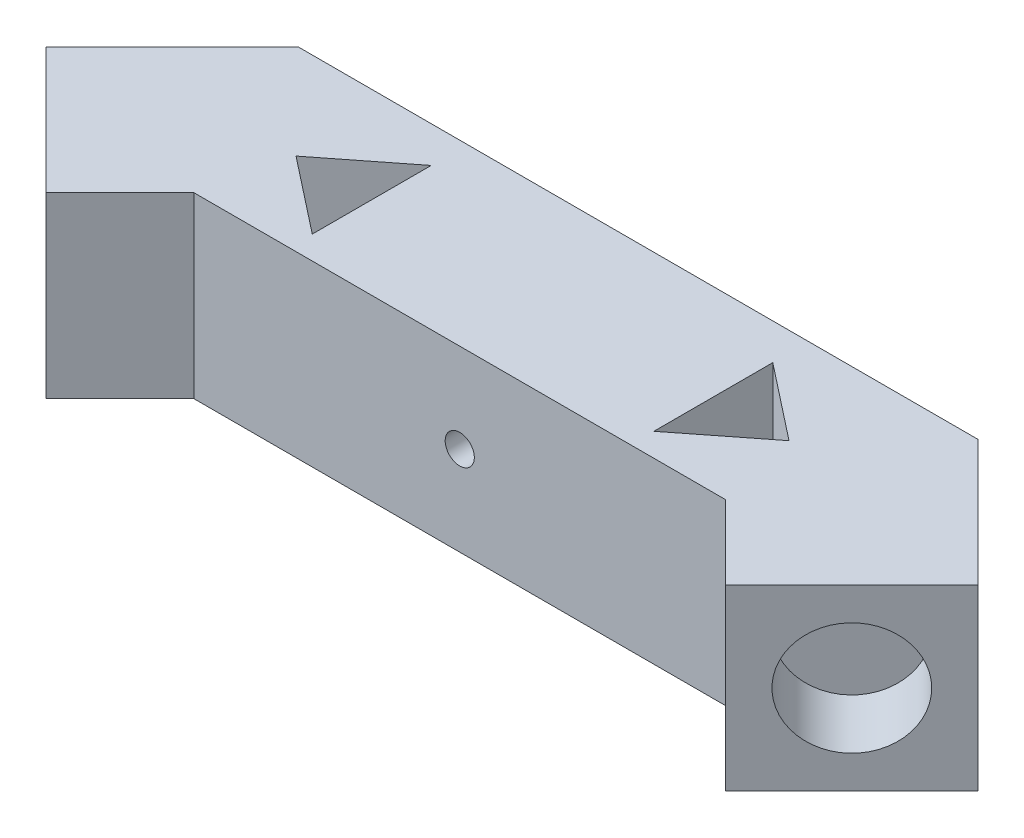
ISO-10303-21;
HEADER;
FILE_DESCRIPTION(('STEP AP214'),'2;1');
FILE_NAME('part.step','',(''),(''),'','','');
FILE_SCHEMA(('AUTOMOTIVE_DESIGN { 1 0 10303 214 1 1 1 1 }'));
ENDSEC;
DATA;
#1=APPLICATION_CONTEXT('core data for automotive mechanical design processes');
#2=APPLICATION_PROTOCOL_DEFINITION('international standard','automotive_design',2000,#1);
#3=PRODUCT_CONTEXT('',#1,'mechanical');
#4=PRODUCT('Part','Part','',(#3));
#5=PRODUCT_RELATED_PRODUCT_CATEGORY('part','',(#4));
#6=PRODUCT_DEFINITION_FORMATION('','',#4);
#7=PRODUCT_DEFINITION_CONTEXT('part definition',#1,'design');
#8=PRODUCT_DEFINITION('design','',#6,#7);
#9=PRODUCT_DEFINITION_SHAPE('','',#8);
#10=(LENGTH_UNIT() NAMED_UNIT(*) SI_UNIT(.MILLI.,.METRE.));
#11=(NAMED_UNIT(*) PLANE_ANGLE_UNIT() SI_UNIT($,.RADIAN.));
#12=(NAMED_UNIT(*) SI_UNIT($,.STERADIAN.) SOLID_ANGLE_UNIT());
#13=UNCERTAINTY_MEASURE_WITH_UNIT(LENGTH_MEASURE(1.E-05),#10,'distance_accuracy_value','');
#14=(GEOMETRIC_REPRESENTATION_CONTEXT(3) GLOBAL_UNCERTAINTY_ASSIGNED_CONTEXT((#13)) GLOBAL_UNIT_ASSIGNED_CONTEXT((#10,
#11,#12)) REPRESENTATION_CONTEXT('',''));
#15=CARTESIAN_POINT('',(0.,0.,0.));
#16=DIRECTION('',(0.,0.,1.));
#17=DIRECTION('',(1.,0.,0.));
#18=AXIS2_PLACEMENT_3D('',#15,#16,#17);
#19=CARTESIAN_POINT('',(0.,38.1,0.));
#20=DIRECTION('',(-0.707106781186549,0.,-0.707106781186546));
#21=DIRECTION('',(-0.707106781186546,0.,0.707106781186549));
#22=AXIS2_PLACEMENT_3D('',#19,#20,#21);
#23=PLANE('',#22);
#24=DIRECTION('',(0.707106781186546,0.,-0.707106781186549));
#25=VECTOR('',#24,1.);
#26=CARTESIAN_POINT('',(0.,0.,0.));
#27=LINE('',#26,#25);
#28=CARTESIAN_POINT('',(-15.7815367264148,0.,15.7815367264148));
#29=VERTEX_POINT('',#28);
#30=CARTESIAN_POINT('',(0.,0.,0.));
#31=VERTEX_POINT('',#30);
#32=EDGE_CURVE('E207',#29,#31,#27,.T.);
#33=ORIENTED_EDGE('',*,*,#32,.T.);
#34=DIRECTION('',(0.,-1.,0.));
#35=VECTOR('',#34,1.);
#36=CARTESIAN_POINT('',(0.,38.1,0.));
#37=LINE('',#36,#35);
#38=CARTESIAN_POINT('',(0.,38.1,0.));
#39=VERTEX_POINT('',#38);
#40=EDGE_CURVE('E11',#39,#31,#37,.T.);
#41=ORIENTED_EDGE('',*,*,#40,.F.);
#42=DIRECTION('',(0.707106781186546,0.,-0.707106781186549));
#43=VECTOR('',#42,1.);
#44=CARTESIAN_POINT('',(0.,38.1,0.));
#45=LINE('',#44,#43);
#46=CARTESIAN_POINT('',(-15.7815367264148,38.1,15.7815367264148));
#47=VERTEX_POINT('',#46);
#48=EDGE_CURVE('E210',#47,#39,#45,.T.);
#49=ORIENTED_EDGE('',*,*,#48,.F.);
#50=DIRECTION('',(0.,-1.,0.));
#51=VECTOR('',#50,1.);
#52=CARTESIAN_POINT('',(-15.7815367264148,38.1,15.7815367264148));
#53=LINE('',#52,#51);
#54=EDGE_CURVE('E228',#47,#29,#53,.T.);
#55=ORIENTED_EDGE('',*,*,#54,.T.);
#56=EDGE_LOOP('',(#33,#41,#49,#55));
#57=FACE_BOUND('',#56,.T.);
#58=ADVANCED_FACE('F42',(#57),#23,.F.);
#59=CARTESIAN_POINT('',(0.,38.1,0.));
#60=DIRECTION('',(0.,0.,-1.));
#61=DIRECTION('',(-1.,0.,0.));
#62=AXIS2_PLACEMENT_3D('',#59,#60,#61);
#63=PLANE('',#62);
#64=CARTESIAN_POINT('',(56.7898329040574,19.05,0.));
#65=DIRECTION('',(0.,0.,-1.));
#66=DIRECTION('',(-1.,0.,0.));
#67=AXIS2_PLACEMENT_3D('',#64,#65,#66);
#68=CIRCLE('',#67,3.1115);
#69=CARTESIAN_POINT('',(53.6783329040574,19.05,0.));
#70=VERTEX_POINT('',#69);
#71=EDGE_CURVE('E166',#70,#70,#68,.T.);
#72=ORIENTED_EDGE('',*,*,#71,.T.);
#73=EDGE_LOOP('',(#72));
#74=FACE_BOUND('',#73,.T.);
#75=DIRECTION('',(1.,0.,0.));
#76=VECTOR('',#75,1.);
#77=CARTESIAN_POINT('',(0.,0.,0.));
#78=LINE('',#77,#76);
#79=CARTESIAN_POINT('',(113.579665808115,0.,0.));
#80=VERTEX_POINT('',#79);
#81=EDGE_CURVE('E231',#31,#80,#78,.T.);
#82=ORIENTED_EDGE('',*,*,#81,.T.);
#83=DIRECTION('',(0.,-1.,0.));
#84=VECTOR('',#83,1.);
#85=CARTESIAN_POINT('',(113.579665808115,38.1,0.));
#86=LINE('',#85,#84);
#87=CARTESIAN_POINT('',(113.579665808115,38.1,0.));
#88=VERTEX_POINT('',#87);
#89=EDGE_CURVE('E49',#88,#80,#86,.T.);
#90=ORIENTED_EDGE('',*,*,#89,.F.);
#91=DIRECTION('',(1.,0.,0.));
#92=VECTOR('',#91,1.);
#93=CARTESIAN_POINT('',(0.,38.1,0.));
#94=LINE('',#93,#92);
#95=EDGE_CURVE('E213',#39,#88,#94,.T.);
#96=ORIENTED_EDGE('',*,*,#95,.F.);
#97=ORIENTED_EDGE('',*,*,#40,.T.);
#98=EDGE_LOOP('',(#82,#90,#96,#97));
#99=FACE_BOUND('',#98,.T.);
#100=ADVANCED_FACE('F287',(#74,#99),#63,.F.);
#101=CARTESIAN_POINT('',(113.579665808115,38.1,0.));
#102=DIRECTION('',(0.707106781186549,0.,-0.707106781186546));
#103=DIRECTION('',(-0.707106781186546,0.,-0.707106781186549));
#104=AXIS2_PLACEMENT_3D('',#101,#102,#103);
#105=PLANE('',#104);
#106=DIRECTION('',(0.707106781186546,0.,0.707106781186549));
#107=VECTOR('',#106,1.);
#108=CARTESIAN_POINT('',(113.579665808115,0.,0.));
#109=LINE('',#108,#107);
#110=CARTESIAN_POINT('',(129.36120253453,0.,15.7815367264148));
#111=VERTEX_POINT('',#110);
#112=EDGE_CURVE('E233',#80,#111,#109,.T.);
#113=ORIENTED_EDGE('',*,*,#112,.T.);
#114=DIRECTION('',(0.,-1.,0.));
#115=VECTOR('',#114,1.);
#116=CARTESIAN_POINT('',(129.36120253453,38.1,15.7815367264148));
#117=LINE('',#116,#115);
#118=CARTESIAN_POINT('',(129.36120253453,38.1,15.7815367264148));
#119=VERTEX_POINT('',#118);
#120=EDGE_CURVE('E258',#119,#111,#117,.T.);
#121=ORIENTED_EDGE('',*,*,#120,.F.);
#122=DIRECTION('',(0.707106781186546,0.,0.707106781186549));
#123=VECTOR('',#122,1.);
#124=CARTESIAN_POINT('',(113.579665808115,38.1,0.));
#125=LINE('',#124,#123);
#126=EDGE_CURVE('E216',#88,#119,#125,.T.);
#127=ORIENTED_EDGE('',*,*,#126,.F.);
#128=ORIENTED_EDGE('',*,*,#89,.T.);
#129=EDGE_LOOP('',(#113,#121,#127,#128));
#130=FACE_BOUND('',#129,.T.);
#131=ADVANCED_FACE('F265',(#130),#105,.F.);
#132=CARTESIAN_POINT('',(156.301970897737,38.1,-11.1592316367926));
#133=DIRECTION('',(-0.707106781186547,0.,-0.707106781186548));
#134=DIRECTION('',(-0.707106781186548,0.,0.707106781186547));
#135=AXIS2_PLACEMENT_3D('',#132,#133,#134);
#136=PLANE('',#135);
#137=CARTESIAN_POINT('',(142.831586716133,19.05,2.31115254481112));
#138=DIRECTION('',(0.707106781186547,0.,0.707106781186548));
#139=DIRECTION('',(0.707106781186548,0.,-0.707106781186547));
#140=AXIS2_PLACEMENT_3D('',#137,#138,#139);
#141=CIRCLE('',#140,12.065);
#142=CARTESIAN_POINT('',(151.362830031149,19.05,-6.22009077020457));
#143=VERTEX_POINT('',#142);
#144=EDGE_CURVE('E174',#143,#143,#141,.T.);
#145=ORIENTED_EDGE('',*,*,#144,.F.);
#146=EDGE_LOOP('',(#145));
#147=FACE_BOUND('',#146,.T.);
#148=DIRECTION('',(0.707106781186548,0.,-0.707106781186547));
#149=VECTOR('',#148,1.);
#150=CARTESIAN_POINT('',(156.301970897737,0.,-11.1592316367926));
#151=LINE('',#150,#149);
#152=CARTESIAN_POINT('',(156.301970897737,0.,-11.1592316367926));
#153=VERTEX_POINT('',#152);
#154=EDGE_CURVE('E235',#111,#153,#151,.T.);
#155=ORIENTED_EDGE('',*,*,#154,.T.);
#156=DIRECTION('',(0.,-1.,0.));
#157=VECTOR('',#156,1.);
#158=CARTESIAN_POINT('',(156.301970897737,38.1,-11.1592316367926));
#159=LINE('',#158,#157);
#160=CARTESIAN_POINT('',(156.301970897737,38.1,-11.1592316367926));
#161=VERTEX_POINT('',#160);
#162=EDGE_CURVE('E255',#161,#153,#159,.T.);
#163=ORIENTED_EDGE('',*,*,#162,.F.);
#164=DIRECTION('',(0.707106781186548,0.,-0.707106781186547));
#165=VECTOR('',#164,1.);
#166=CARTESIAN_POINT('',(156.301970897737,38.1,-11.1592316367926));
#167=LINE('',#166,#165);
#168=EDGE_CURVE('E218',#119,#161,#167,.T.);
#169=ORIENTED_EDGE('',*,*,#168,.F.);
#170=ORIENTED_EDGE('',*,*,#120,.T.);
#171=EDGE_LOOP('',(#155,#163,#169,#170));
#172=FACE_BOUND('',#171,.T.);
#173=ADVANCED_FACE('F275',(#147,#172),#136,.F.);
#174=CARTESIAN_POINT('',(129.361202534529,38.1,-38.1));
#175=DIRECTION('',(-0.707106781186544,0.,0.707106781186551));
#176=DIRECTION('',(0.707106781186551,0.,0.707106781186544));
#177=AXIS2_PLACEMENT_3D('',#174,#175,#176);
#178=PLANE('',#177);
#179=DIRECTION('',(-0.707106781186551,0.,-0.707106781186544));
#180=VECTOR('',#179,1.);
#181=CARTESIAN_POINT('',(129.361202534529,0.,-38.1));
#182=LINE('',#181,#180);
#183=CARTESIAN_POINT('',(129.361202534529,0.,-38.1));
#184=VERTEX_POINT('',#183);
#185=EDGE_CURVE('E237',#153,#184,#182,.T.);
#186=ORIENTED_EDGE('',*,*,#185,.T.);
#187=DIRECTION('',(0.,-1.,0.));
#188=VECTOR('',#187,1.);
#189=CARTESIAN_POINT('',(129.361202534529,38.1,-38.1));
#190=LINE('',#189,#188);
#191=CARTESIAN_POINT('',(129.361202534529,38.1,-38.1));
#192=VERTEX_POINT('',#191);
#193=EDGE_CURVE('E252',#192,#184,#190,.T.);
#194=ORIENTED_EDGE('',*,*,#193,.F.);
#195=DIRECTION('',(-0.707106781186551,0.,-0.707106781186544));
#196=VECTOR('',#195,1.);
#197=CARTESIAN_POINT('',(129.361202534529,38.1,-38.1));
#198=LINE('',#197,#196);
#199=EDGE_CURVE('E220',#161,#192,#198,.T.);
#200=ORIENTED_EDGE('',*,*,#199,.F.);
#201=ORIENTED_EDGE('',*,*,#162,.T.);
#202=EDGE_LOOP('',(#186,#194,#200,#201));
#203=FACE_BOUND('',#202,.T.);
#204=ADVANCED_FACE('F279',(#203),#178,.F.);
#205=CARTESIAN_POINT('',(-15.7815367264146,38.1,-38.1));
#206=DIRECTION('',(0.,0.,1.));
#207=DIRECTION('',(1.,0.,0.));
#208=AXIS2_PLACEMENT_3D('',#205,#206,#207);
#209=PLANE('',#208);
#210=CARTESIAN_POINT('',(56.7898329040574,19.05,-38.1));
#211=DIRECTION('',(0.,0.,-1.));
#212=DIRECTION('',(-1.,0.,0.));
#213=AXIS2_PLACEMENT_3D('',#210,#211,#212);
#214=CIRCLE('',#213,3.1115);
#215=CARTESIAN_POINT('',(53.6783329040574,19.05,-38.1));
#216=VERTEX_POINT('',#215);
#217=EDGE_CURVE('E454',#216,#216,#214,.T.);
#218=ORIENTED_EDGE('',*,*,#217,.F.);
#219=EDGE_LOOP('',(#218));
#220=FACE_BOUND('',#219,.T.);
#221=DIRECTION('',(-1.,0.,0.));
#222=VECTOR('',#221,1.);
#223=CARTESIAN_POINT('',(-15.7815367264146,0.,-38.1));
#224=LINE('',#223,#222);
#225=CARTESIAN_POINT('',(-15.7815367264146,0.,-38.1));
#226=VERTEX_POINT('',#225);
#227=EDGE_CURVE('E239',#184,#226,#224,.T.);
#228=ORIENTED_EDGE('',*,*,#227,.T.);
#229=DIRECTION('',(0.,-1.,0.));
#230=VECTOR('',#229,1.);
#231=CARTESIAN_POINT('',(-15.7815367264146,38.1,-38.1));
#232=LINE('',#231,#230);
#233=CARTESIAN_POINT('',(-15.7815367264146,38.1,-38.1));
#234=VERTEX_POINT('',#233);
#235=EDGE_CURVE('E249',#234,#226,#232,.T.);
#236=ORIENTED_EDGE('',*,*,#235,.F.);
#237=DIRECTION('',(-1.,0.,0.));
#238=VECTOR('',#237,1.);
#239=CARTESIAN_POINT('',(-15.7815367264146,38.1,-38.1));
#240=LINE('',#239,#238);
#241=EDGE_CURVE('E222',#192,#234,#240,.T.);
#242=ORIENTED_EDGE('',*,*,#241,.F.);
#243=ORIENTED_EDGE('',*,*,#193,.T.);
#244=EDGE_LOOP('',(#228,#236,#242,#243));
#245=FACE_BOUND('',#244,.T.);
#246=ADVANCED_FACE('F300',(#220,#245),#209,.F.);
#247=CARTESIAN_POINT('',(-15.7815367264146,38.1,-38.1));
#248=DIRECTION('',(0.707106781186544,0.,0.707106781186551));
#249=DIRECTION('',(0.707106781186551,0.,-0.707106781186544));
#250=AXIS2_PLACEMENT_3D('',#247,#248,#249);
#251=PLANE('',#250);
#252=DIRECTION('',(-0.707106781186551,0.,0.707106781186544));
#253=VECTOR('',#252,1.);
#254=CARTESIAN_POINT('',(-15.7815367264146,0.,-38.1));
#255=LINE('',#254,#253);
#256=CARTESIAN_POINT('',(-42.7223050896222,0.,-11.1592316367926));
#257=VERTEX_POINT('',#256);
#258=EDGE_CURVE('E241',#226,#257,#255,.T.);
#259=ORIENTED_EDGE('',*,*,#258,.T.);
#260=DIRECTION('',(0.,-1.,0.));
#261=VECTOR('',#260,1.);
#262=CARTESIAN_POINT('',(-42.7223050896222,38.1,-11.1592316367926));
#263=LINE('',#262,#261);
#264=CARTESIAN_POINT('',(-42.7223050896222,38.1,-11.1592316367926));
#265=VERTEX_POINT('',#264);
#266=EDGE_CURVE('E246',#265,#257,#263,.T.);
#267=ORIENTED_EDGE('',*,*,#266,.F.);
#268=DIRECTION('',(-0.707106781186551,0.,0.707106781186544));
#269=VECTOR('',#268,1.);
#270=CARTESIAN_POINT('',(-15.7815367264146,38.1,-38.1));
#271=LINE('',#270,#269);
#272=EDGE_CURVE('E224',#234,#265,#271,.T.);
#273=ORIENTED_EDGE('',*,*,#272,.F.);
#274=ORIENTED_EDGE('',*,*,#235,.T.);
#275=EDGE_LOOP('',(#259,#267,#273,#274));
#276=FACE_BOUND('',#275,.T.);
#277=ADVANCED_FACE('F298',(#276),#251,.F.);
#278=CARTESIAN_POINT('',(-42.7223050896222,38.1,-11.1592316367926));
#279=DIRECTION('',(0.707106781186547,0.,-0.707106781186548));
#280=DIRECTION('',(-0.707106781186548,0.,-0.707106781186547));
#281=AXIS2_PLACEMENT_3D('',#278,#279,#280);
#282=PLANE('',#281);
#283=CARTESIAN_POINT('',(-29.2519209080186,19.05,2.31115254481109));
#284=DIRECTION('',(-0.707106781186547,0.,0.707106781186548));
#285=DIRECTION('',(0.707106781186548,0.,0.707106781186547));
#286=AXIS2_PLACEMENT_3D('',#283,#284,#285);
#287=CIRCLE('',#286,12.065);
#288=CARTESIAN_POINT('',(-20.7206775930028,19.05,10.8423958598268));
#289=VERTEX_POINT('',#288);
#290=EDGE_CURVE('E201',#289,#289,#287,.T.);
#291=ORIENTED_EDGE('',*,*,#290,.F.);
#292=EDGE_LOOP('',(#291));
#293=FACE_BOUND('',#292,.T.);
#294=DIRECTION('',(0.707106781186548,0.,0.707106781186547));
#295=VECTOR('',#294,1.);
#296=CARTESIAN_POINT('',(-42.7223050896222,0.,-11.1592316367926));
#297=LINE('',#296,#295);
#298=EDGE_CURVE('E214',#257,#29,#297,.T.);
#299=ORIENTED_EDGE('',*,*,#298,.T.);
#300=ORIENTED_EDGE('',*,*,#54,.F.);
#301=DIRECTION('',(0.707106781186548,0.,0.707106781186547));
#302=VECTOR('',#301,1.);
#303=CARTESIAN_POINT('',(-42.7223050896222,38.1,-11.1592316367926));
#304=LINE('',#303,#302);
#305=EDGE_CURVE('E226',#265,#47,#304,.T.);
#306=ORIENTED_EDGE('',*,*,#305,.F.);
#307=ORIENTED_EDGE('',*,*,#266,.T.);
#308=EDGE_LOOP('',(#299,#300,#306,#307));
#309=FACE_BOUND('',#308,.T.);
#310=ADVANCED_FACE('F293',(#293,#309),#282,.F.);
#311=CARTESIAN_POINT('',(0.,38.1,0.));
#312=DIRECTION('',(0.,1.,0.));
#313=DIRECTION('',(0.,0.,1.));
#314=AXIS2_PLACEMENT_3D('',#311,#312,#313);
#315=PLANE('',#314);
#316=DIRECTION('',(0.786407597023069,0.,0.617707933690674));
#317=VECTOR('',#316,1.);
#318=CARTESIAN_POINT('',(20.32,38.1,-4.97682129544743));
#319=LINE('',#318,#317);
#320=CARTESIAN_POINT('',(4.15155543669238,38.1,-17.6768212954474));
#321=VERTEX_POINT('',#320);
#322=CARTESIAN_POINT('',(20.32,38.1,-4.97682129544743));
#323=VERTEX_POINT('',#322);
#324=EDGE_CURVE('E56',#321,#323,#319,.T.);
#325=ORIENTED_EDGE('',*,*,#324,.F.);
#326=DIRECTION('',(-0.786407597023069,0.,0.617707933690674));
#327=VECTOR('',#326,1.);
#328=CARTESIAN_POINT('',(4.15155543669238,38.1,-17.6768212954474));
#329=LINE('',#328,#327);
#330=CARTESIAN_POINT('',(20.32,38.1,-30.3768212954474));
#331=VERTEX_POINT('',#330);
#332=EDGE_CURVE('E160',#331,#321,#329,.T.);
#333=ORIENTED_EDGE('',*,*,#332,.F.);
#334=DIRECTION('',(0.,0.,-1.));
#335=VECTOR('',#334,1.);
#336=CARTESIAN_POINT('',(20.32,38.1,-30.3768212954474));
#337=LINE('',#336,#335);
#338=EDGE_CURVE('E163',#323,#331,#337,.T.);
#339=ORIENTED_EDGE('',*,*,#338,.F.);
#340=EDGE_LOOP('',(#325,#333,#339));
#341=FACE_BOUND('',#340,.T.);
#342=DIRECTION('',(-0.786407597023069,0.,-0.617707933690674));
#343=VECTOR('',#342,1.);
#344=CARTESIAN_POINT('',(109.428110371422,38.1,-17.6768212954474));
#345=LINE('',#344,#343);
#346=CARTESIAN_POINT('',(109.428110371422,38.1,-17.6768212954474));
#347=VERTEX_POINT('',#346);
#348=CARTESIAN_POINT('',(93.2596658081147,38.1,-30.3768212954474));
#349=VERTEX_POINT('',#348);
#350=EDGE_CURVE('E64',#347,#349,#345,.T.);
#351=ORIENTED_EDGE('',*,*,#350,.F.);
#352=DIRECTION('',(0.786407597023068,0.,-0.617707933690675));
#353=VECTOR('',#352,1.);
#354=CARTESIAN_POINT('',(93.2596658081148,38.1,-4.97682129544743));
#355=LINE('',#354,#353);
#356=CARTESIAN_POINT('',(93.2596658081148,38.1,-4.97682129544743));
#357=VERTEX_POINT('',#356);
#358=EDGE_CURVE('E183',#357,#347,#355,.T.);
#359=ORIENTED_EDGE('',*,*,#358,.F.);
#360=DIRECTION('',(0.,0.,1.));
#361=VECTOR('',#360,1.);
#362=CARTESIAN_POINT('',(93.2596658081147,38.1,-30.3768212954474));
#363=LINE('',#362,#361);
#364=EDGE_CURVE('E186',#349,#357,#363,.T.);
#365=ORIENTED_EDGE('',*,*,#364,.F.);
#366=EDGE_LOOP('',(#351,#359,#365));
#367=FACE_BOUND('',#366,.T.);
#368=ORIENTED_EDGE('',*,*,#48,.T.);
#369=ORIENTED_EDGE('',*,*,#95,.T.);
#370=ORIENTED_EDGE('',*,*,#126,.T.);
#371=ORIENTED_EDGE('',*,*,#168,.T.);
#372=ORIENTED_EDGE('',*,*,#199,.T.);
#373=ORIENTED_EDGE('',*,*,#241,.T.);
#374=ORIENTED_EDGE('',*,*,#272,.T.);
#375=ORIENTED_EDGE('',*,*,#305,.T.);
#376=EDGE_LOOP('',(#368,#369,#370,#371,#372,#373,#374,#375));
#377=FACE_BOUND('',#376,.T.);
#378=ADVANCED_FACE('F283',(#341,#367,#377),#315,.T.);
#379=CARTESIAN_POINT('',(0.,0.,0.));
#380=DIRECTION('',(0.,1.,0.));
#381=DIRECTION('',(0.,0.,1.));
#382=AXIS2_PLACEMENT_3D('',#379,#380,#381);
#383=PLANE('',#382);
#384=DIRECTION('',(-0.786407597023069,0.,0.617707933690674));
#385=VECTOR('',#384,1.);
#386=CARTESIAN_POINT('',(4.15155543669238,0.,-17.6768212954474));
#387=LINE('',#386,#385);
#388=CARTESIAN_POINT('',(20.32,0.,-30.3768212954474));
#389=VERTEX_POINT('',#388);
#390=CARTESIAN_POINT('',(4.15155543669238,0.,-17.6768212954474));
#391=VERTEX_POINT('',#390);
#392=EDGE_CURVE('E150',#389,#391,#387,.T.);
#393=ORIENTED_EDGE('',*,*,#392,.T.);
#394=DIRECTION('',(0.786407597023069,0.,0.617707933690674));
#395=VECTOR('',#394,1.);
#396=CARTESIAN_POINT('',(20.32,0.,-4.97682129544743));
#397=LINE('',#396,#395);
#398=CARTESIAN_POINT('',(20.32,0.,-4.97682129544743));
#399=VERTEX_POINT('',#398);
#400=EDGE_CURVE('E144',#391,#399,#397,.T.);
#401=ORIENTED_EDGE('',*,*,#400,.T.);
#402=DIRECTION('',(0.,0.,-1.));
#403=VECTOR('',#402,1.);
#404=CARTESIAN_POINT('',(20.32,0.,-30.3768212954474));
#405=LINE('',#404,#403);
#406=EDGE_CURVE('E154',#399,#389,#405,.T.);
#407=ORIENTED_EDGE('',*,*,#406,.T.);
#408=EDGE_LOOP('',(#393,#401,#407));
#409=FACE_BOUND('',#408,.T.);
#410=DIRECTION('',(0.786407597023068,0.,-0.617707933690675));
#411=VECTOR('',#410,1.);
#412=CARTESIAN_POINT('',(93.2596658081148,0.,-4.97682129544743));
#413=LINE('',#412,#411);
#414=CARTESIAN_POINT('',(93.2596658081148,0.,-4.97682129544743));
#415=VERTEX_POINT('',#414);
#416=CARTESIAN_POINT('',(109.428110371422,0.,-17.6768212954474));
#417=VERTEX_POINT('',#416);
#418=EDGE_CURVE('E178',#415,#417,#413,.T.);
#419=ORIENTED_EDGE('',*,*,#418,.T.);
#420=DIRECTION('',(-0.786407597023069,0.,-0.617707933690674));
#421=VECTOR('',#420,1.);
#422=CARTESIAN_POINT('',(109.428110371422,0.,-17.6768212954474));
#423=LINE('',#422,#421);
#424=CARTESIAN_POINT('',(93.2596658081147,0.,-30.3768212954474));
#425=VERTEX_POINT('',#424);
#426=EDGE_CURVE('E187',#417,#425,#423,.T.);
#427=ORIENTED_EDGE('',*,*,#426,.T.);
#428=DIRECTION('',(0.,0.,1.));
#429=VECTOR('',#428,1.);
#430=CARTESIAN_POINT('',(93.2596658081147,0.,-30.3768212954474));
#431=LINE('',#430,#429);
#432=EDGE_CURVE('E193',#425,#415,#431,.T.);
#433=ORIENTED_EDGE('',*,*,#432,.T.);
#434=EDGE_LOOP('',(#419,#427,#433));
#435=FACE_BOUND('',#434,.T.);
#436=ORIENTED_EDGE('',*,*,#32,.F.);
#437=ORIENTED_EDGE('',*,*,#298,.F.);
#438=ORIENTED_EDGE('',*,*,#258,.F.);
#439=ORIENTED_EDGE('',*,*,#227,.F.);
#440=ORIENTED_EDGE('',*,*,#185,.F.);
#441=ORIENTED_EDGE('',*,*,#154,.F.);
#442=ORIENTED_EDGE('',*,*,#112,.F.);
#443=ORIENTED_EDGE('',*,*,#81,.F.);
#444=EDGE_LOOP('',(#436,#437,#438,#439,#440,#441,#442,#443));
#445=FACE_BOUND('',#444,.T.);
#446=ADVANCED_FACE('F158',(#409,#435,#445),#383,.F.);
#447=CARTESIAN_POINT('',(-18.4756135627356,19.05,-8.46515480047189));
#448=DIRECTION('',(-0.707106781186547,0.,0.707106781186548));
#449=DIRECTION('',(0.707106781186548,0.,0.707106781186547));
#450=AXIS2_PLACEMENT_3D('',#447,#448,#449);
#451=CYLINDRICAL_SURFACE('',#450,12.065);
#452=CARTESIAN_POINT('',(-18.4756135627356,19.05,-8.46515480047189));
#453=DIRECTION('',(-0.707106781186547,0.,0.707106781186548));
#454=DIRECTION('',(0.707106781186548,0.,0.707106781186547));
#455=AXIS2_PLACEMENT_3D('',#452,#453,#454);
#456=CIRCLE('',#455,12.065);
#457=CARTESIAN_POINT('',(-9.94437024771987,19.05,0.066088514543804));
#458=VERTEX_POINT('',#457);
#459=EDGE_CURVE('E204',#458,#458,#456,.T.);
#460=ORIENTED_EDGE('',*,*,#459,.F.);
#461=EDGE_LOOP('',(#460));
#462=FACE_BOUND('',#461,.T.);
#463=ORIENTED_EDGE('',*,*,#290,.T.);
#464=EDGE_LOOP('',(#463));
#465=FACE_BOUND('',#464,.T.);
#466=ADVANCED_FACE('F343',(#462,#465),#451,.F.);
#467=CARTESIAN_POINT('',(-18.4756135627356,19.05,-8.46515480047189));
#468=DIRECTION('',(-0.707106781186547,0.,0.707106781186548));
#469=DIRECTION('',(0.707106781186548,0.,0.707106781186547));
#470=AXIS2_PLACEMENT_3D('',#467,#468,#469);
#471=PLANE('',#470);
#472=ORIENTED_EDGE('',*,*,#459,.T.);
#473=EDGE_LOOP('',(#472));
#474=FACE_BOUND('',#473,.T.);
#475=ADVANCED_FACE('F334',(#474),#471,.T.);
#476=CARTESIAN_POINT('',(132.05527937085,19.05,-8.46515480047186));
#477=DIRECTION('',(0.707106781186547,0.,0.707106781186548));
#478=DIRECTION('',(0.707106781186548,0.,-0.707106781186547));
#479=AXIS2_PLACEMENT_3D('',#476,#477,#478);
#480=CYLINDRICAL_SURFACE('',#479,12.065);
#481=CARTESIAN_POINT('',(132.05527937085,19.05,-8.46515480047186));
#482=DIRECTION('',(0.707106781186547,0.,0.707106781186548));
#483=DIRECTION('',(0.707106781186548,0.,-0.707106781186547));
#484=AXIS2_PLACEMENT_3D('',#481,#482,#483);
#485=CIRCLE('',#484,12.065);
#486=CARTESIAN_POINT('',(140.586522685866,19.05,-16.9963981154876));
#487=VERTEX_POINT('',#486);
#488=EDGE_CURVE('E198',#487,#487,#485,.T.);
#489=ORIENTED_EDGE('',*,*,#488,.F.);
#490=EDGE_LOOP('',(#489));
#491=FACE_BOUND('',#490,.T.);
#492=ORIENTED_EDGE('',*,*,#144,.T.);
#493=EDGE_LOOP('',(#492));
#494=FACE_BOUND('',#493,.T.);
#495=ADVANCED_FACE('F332',(#491,#494),#480,.F.);
#496=CARTESIAN_POINT('',(132.05527937085,19.05,-8.46515480047186));
#497=DIRECTION('',(0.707106781186547,0.,0.707106781186548));
#498=DIRECTION('',(0.707106781186548,0.,-0.707106781186547));
#499=AXIS2_PLACEMENT_3D('',#496,#497,#498);
#500=PLANE('',#499);
#501=ORIENTED_EDGE('',*,*,#488,.T.);
#502=EDGE_LOOP('',(#501));
#503=FACE_BOUND('',#502,.T.);
#504=ADVANCED_FACE('F333',(#503),#500,.T.);
#505=CARTESIAN_POINT('',(109.428110371422,0.,-17.6768212954474));
#506=DIRECTION('',(0.617707933690674,0.,-0.786407597023069));
#507=DIRECTION('',(-0.786407597023069,0.,-0.617707933690674));
#508=AXIS2_PLACEMENT_3D('',#505,#506,#507);
#509=PLANE('',#508);
#510=ORIENTED_EDGE('',*,*,#350,.T.);
#511=DIRECTION('',(0.,1.,0.));
#512=VECTOR('',#511,1.);
#513=CARTESIAN_POINT('',(93.2596658081147,0.,-30.3768212954474));
#514=LINE('',#513,#512);
#515=EDGE_CURVE('E176',#425,#349,#514,.T.);
#516=ORIENTED_EDGE('',*,*,#515,.F.);
#517=ORIENTED_EDGE('',*,*,#426,.F.);
#518=DIRECTION('',(0.,1.,0.));
#519=VECTOR('',#518,1.);
#520=CARTESIAN_POINT('',(109.428110371422,0.,-17.6768212954474));
#521=LINE('',#520,#519);
#522=EDGE_CURVE('E181',#417,#347,#521,.T.);
#523=ORIENTED_EDGE('',*,*,#522,.T.);
#524=EDGE_LOOP('',(#510,#516,#517,#523));
#525=FACE_BOUND('',#524,.T.);
#526=ADVANCED_FACE('F340',(#525),#509,.F.);
#527=CARTESIAN_POINT('',(93.2596658081148,0.,-4.97682129544743));
#528=DIRECTION('',(0.617707933690675,0.,0.786407597023068));
#529=DIRECTION('',(0.786407597023068,0.,-0.617707933690675));
#530=AXIS2_PLACEMENT_3D('',#527,#528,#529);
#531=PLANE('',#530);
#532=ORIENTED_EDGE('',*,*,#358,.T.);
#533=ORIENTED_EDGE('',*,*,#522,.F.);
#534=ORIENTED_EDGE('',*,*,#418,.F.);
#535=DIRECTION('',(0.,1.,0.));
#536=VECTOR('',#535,1.);
#537=CARTESIAN_POINT('',(93.2596658081148,0.,-4.97682129544743));
#538=LINE('',#537,#536);
#539=EDGE_CURVE('E179',#415,#357,#538,.T.);
#540=ORIENTED_EDGE('',*,*,#539,.T.);
#541=EDGE_LOOP('',(#532,#533,#534,#540));
#542=FACE_BOUND('',#541,.T.);
#543=ADVANCED_FACE('F397',(#542),#531,.F.);
#544=CARTESIAN_POINT('',(93.2596658081147,0.,-30.3768212954474));
#545=DIRECTION('',(-1.,0.,0.));
#546=DIRECTION('',(0.,0.,1.));
#547=AXIS2_PLACEMENT_3D('',#544,#545,#546);
#548=PLANE('',#547);
#549=ORIENTED_EDGE('',*,*,#364,.T.);
#550=ORIENTED_EDGE('',*,*,#539,.F.);
#551=ORIENTED_EDGE('',*,*,#432,.F.);
#552=ORIENTED_EDGE('',*,*,#515,.T.);
#553=EDGE_LOOP('',(#549,#550,#551,#552));
#554=FACE_BOUND('',#553,.T.);
#555=ADVANCED_FACE('F406',(#554),#548,.F.);
#556=CARTESIAN_POINT('',(20.32,0.,-4.97682129544743));
#557=DIRECTION('',(-0.617707933690675,0.,0.786407597023069));
#558=DIRECTION('',(0.786407597023069,0.,0.617707933690674));
#559=AXIS2_PLACEMENT_3D('',#556,#557,#558);
#560=PLANE('',#559);
#561=ORIENTED_EDGE('',*,*,#324,.T.);
#562=DIRECTION('',(0.,1.,0.));
#563=VECTOR('',#562,1.);
#564=CARTESIAN_POINT('',(20.32,0.,-4.97682129544743));
#565=LINE('',#564,#563);
#566=EDGE_CURVE('E140',#399,#323,#565,.T.);
#567=ORIENTED_EDGE('',*,*,#566,.F.);
#568=ORIENTED_EDGE('',*,*,#400,.F.);
#569=DIRECTION('',(0.,1.,0.));
#570=VECTOR('',#569,1.);
#571=CARTESIAN_POINT('',(4.15155543669238,0.,-17.6768212954474));
#572=LINE('',#571,#570);
#573=EDGE_CURVE('E172',#391,#321,#572,.T.);
#574=ORIENTED_EDGE('',*,*,#573,.T.);
#575=EDGE_LOOP('',(#561,#567,#568,#574));
#576=FACE_BOUND('',#575,.T.);
#577=ADVANCED_FACE('F142',(#576),#560,.F.);
#578=CARTESIAN_POINT('',(4.15155543669238,0.,-17.6768212954474));
#579=DIRECTION('',(-0.617707933690675,0.,-0.786407597023069));
#580=DIRECTION('',(-0.786407597023069,0.,0.617707933690674));
#581=AXIS2_PLACEMENT_3D('',#578,#579,#580);
#582=PLANE('',#581);
#583=ORIENTED_EDGE('',*,*,#332,.T.);
#584=ORIENTED_EDGE('',*,*,#573,.F.);
#585=ORIENTED_EDGE('',*,*,#392,.F.);
#586=DIRECTION('',(0.,1.,0.));
#587=VECTOR('',#586,1.);
#588=CARTESIAN_POINT('',(20.32,0.,-30.3768212954474));
#589=LINE('',#588,#587);
#590=EDGE_CURVE('E149',#389,#331,#589,.T.);
#591=ORIENTED_EDGE('',*,*,#590,.T.);
#592=EDGE_LOOP('',(#583,#584,#585,#591));
#593=FACE_BOUND('',#592,.T.);
#594=ADVANCED_FACE('F424',(#593),#582,.F.);
#595=CARTESIAN_POINT('',(20.32,0.,-30.3768212954474));
#596=DIRECTION('',(1.,0.,0.));
#597=DIRECTION('',(0.,0.,-1.));
#598=AXIS2_PLACEMENT_3D('',#595,#596,#597);
#599=PLANE('',#598);
#600=ORIENTED_EDGE('',*,*,#338,.T.);
#601=ORIENTED_EDGE('',*,*,#590,.F.);
#602=ORIENTED_EDGE('',*,*,#406,.F.);
#603=ORIENTED_EDGE('',*,*,#566,.T.);
#604=EDGE_LOOP('',(#600,#601,#602,#603));
#605=FACE_BOUND('',#604,.T.);
#606=ADVANCED_FACE('F155',(#605),#599,.F.);
#607=CARTESIAN_POINT('',(56.7898329040574,19.05,8.38200000000006));
#608=DIRECTION('',(0.,0.,-1.));
#609=DIRECTION('',(-1.,0.,0.));
#610=AXIS2_PLACEMENT_3D('',#607,#608,#609);
#611=CYLINDRICAL_SURFACE('',#610,3.1115);
#612=CARTESIAN_POINT('',(53.6783329040574,19.05,-38.1));
#613=CARTESIAN_POINT('',(53.6783329040574,19.05,-37.703125));
#614=CARTESIAN_POINT('',(53.6783329040574,19.05,-37.3062499999999));
#615=CARTESIAN_POINT('',(53.6783329040574,19.05,-36.5125));
#616=CARTESIAN_POINT('',(53.6783329040574,19.05,-36.115625));
#617=CARTESIAN_POINT('',(53.6783329040574,19.05,-35.321875));
#618=CARTESIAN_POINT('',(53.6783329040574,19.05,-34.925));
#619=CARTESIAN_POINT('',(53.6783329040574,19.05,-34.13125));
#620=CARTESIAN_POINT('',(53.6783329040574,19.05,-33.734375));
#621=CARTESIAN_POINT('',(53.6783329040574,19.05,-32.940625));
#622=CARTESIAN_POINT('',(53.6783329040574,19.05,-32.54375));
#623=CARTESIAN_POINT('',(53.6783329040574,19.05,-31.75));
#624=CARTESIAN_POINT('',(53.6783329040574,19.05,-31.353125));
#625=CARTESIAN_POINT('',(53.6783329040574,19.05,-30.559375));
#626=CARTESIAN_POINT('',(53.6783329040574,19.05,-30.1625));
#627=CARTESIAN_POINT('',(53.6783329040574,19.05,-29.36875));
#628=CARTESIAN_POINT('',(53.6783329040574,19.05,-28.971875));
#629=CARTESIAN_POINT('',(53.6783329040574,19.05,-28.178125));
#630=CARTESIAN_POINT('',(53.6783329040574,19.05,-27.78125));
#631=CARTESIAN_POINT('',(53.6783329040574,19.05,-26.9875));
#632=CARTESIAN_POINT('',(53.6783329040574,19.05,-26.590625));
#633=CARTESIAN_POINT('',(53.6783329040574,19.05,-25.796875));
#634=CARTESIAN_POINT('',(53.6783329040574,19.05,-25.4));
#635=CARTESIAN_POINT('',(53.6783329040574,19.05,-24.60625));
#636=CARTESIAN_POINT('',(53.6783329040574,19.05,-24.209375));
#637=CARTESIAN_POINT('',(53.6783329040574,19.05,-23.415625));
#638=CARTESIAN_POINT('',(53.6783329040574,19.05,-23.01875));
#639=CARTESIAN_POINT('',(53.6783329040574,19.05,-22.225));
#640=CARTESIAN_POINT('',(53.6783329040574,19.05,-21.828125));
#641=CARTESIAN_POINT('',(53.6783329040574,19.05,-21.034375));
#642=CARTESIAN_POINT('',(53.6783329040574,19.05,-20.6375));
#643=CARTESIAN_POINT('',(53.6783329040574,19.05,-19.84375));
#644=CARTESIAN_POINT('',(53.6783329040574,19.05,-19.446875));
#645=CARTESIAN_POINT('',(53.6783329040574,19.05,-18.653125));
#646=CARTESIAN_POINT('',(53.6783329040574,19.05,-18.25625));
#647=CARTESIAN_POINT('',(53.6783329040574,19.05,-17.4625));
#648=CARTESIAN_POINT('',(53.6783329040574,19.05,-17.065625));
#649=CARTESIAN_POINT('',(53.6783329040574,19.05,-16.271875));
#650=CARTESIAN_POINT('',(53.6783329040574,19.05,-15.875));
#651=CARTESIAN_POINT('',(53.6783329040574,19.05,-15.08125));
#652=CARTESIAN_POINT('',(53.6783329040574,19.05,-14.684375));
#653=CARTESIAN_POINT('',(53.6783329040574,19.05,-13.890625));
#654=CARTESIAN_POINT('',(53.6783329040574,19.05,-13.49375));
#655=CARTESIAN_POINT('',(53.6783329040574,19.05,-12.7));
#656=CARTESIAN_POINT('',(53.6783329040574,19.05,-12.303125));
#657=CARTESIAN_POINT('',(53.6783329040574,19.05,-11.509375));
#658=CARTESIAN_POINT('',(53.6783329040574,19.05,-11.1125));
#659=CARTESIAN_POINT('',(53.6783329040574,19.05,-10.31875));
#660=CARTESIAN_POINT('',(53.6783329040574,19.05,-9.92187499999999));
#661=CARTESIAN_POINT('',(53.6783329040574,19.05,-9.12812499999999));
#662=CARTESIAN_POINT('',(53.6783329040574,19.05,-8.73124999999999));
#663=CARTESIAN_POINT('',(53.6783329040574,19.05,-7.93749999999999));
#664=CARTESIAN_POINT('',(53.6783329040574,19.05,-7.540625));
#665=CARTESIAN_POINT('',(53.6783329040574,19.05,-6.74687499999999));
#666=CARTESIAN_POINT('',(53.6783329040574,19.05,-6.35));
#667=CARTESIAN_POINT('',(53.6783329040574,19.05,-5.55625));
#668=CARTESIAN_POINT('',(53.6783329040574,19.05,-5.159375));
#669=CARTESIAN_POINT('',(53.6783329040574,19.05,-4.365625));
#670=CARTESIAN_POINT('',(53.6783329040574,19.05,-3.96875));
#671=CARTESIAN_POINT('',(53.6783329040574,19.05,-3.175));
#672=CARTESIAN_POINT('',(53.6783329040574,19.05,-2.778125));
#673=CARTESIAN_POINT('',(53.6783329040574,19.05,-1.984375));
#674=CARTESIAN_POINT('',(53.6783329040574,19.05,-1.5875));
#675=CARTESIAN_POINT('',(53.6783329040574,19.05,-0.793750000000006));
#676=CARTESIAN_POINT('',(53.6783329040574,19.05,-0.396875000000006));
#677=CARTESIAN_POINT('',(53.6783329040574,19.05,0.));
#678=B_SPLINE_CURVE_WITH_KNOTS('',3,(#612,#613,#614,#615,#616,#617,#618,#619,#620,#621,#622,
#623,#624,#625,#626,#627,#628,#629,#630,#631,#632,#633,#634,#635,#636,#637,#638,#639,#640,#641,
#642,#643,#644,#645,#646,#647,#648,#649,#650,#651,#652,#653,#654,#655,#656,#657,#658,#659,#660,
#661,#662,#663,#664,#665,#666,#667,#668,#669,#670,#671,#672,#673,#674,#675,#676,#677),
.UNSPECIFIED.,.F.,.F.,(4,2,2,2,2,2,2,2,2,2,2,2,2,2,2,2,2,2,2,2,2,2,2,2,2,2,2,2,2,2,2,2,4),(0.,
1.190625,2.38124999999999,3.571875,4.7625,5.95312499999999,7.14374999999999,8.33437499999999,
9.52499999999999,10.715625,11.90625,13.096875,14.2875,15.478125,16.66875,17.859375,19.05,
20.240625,21.43125,22.621875,23.8125,25.003125,26.19375,27.384375,28.575,29.765625,30.95625,
32.146875,33.3374999999999,34.528125,35.71875,36.9093749999999,38.0999999999999),.UNSPECIFIED.);
#679=EDGE_CURVE('BSEAM441',#216,#70,#678,.T.);
#680=ORIENTED_EDGE('',*,*,#217,.T.);
#681=ORIENTED_EDGE('',*,*,#71,.F.);
#682=ORIENTED_EDGE('',*,*,#679,.T.);
#683=ORIENTED_EDGE('',*,*,#679,.F.);
#684=EDGE_LOOP('',(#680,#682,#681,#683));
#685=FACE_BOUND('',#684,.T.);
#686=ADVANCED_FACE('F441',(#685),#611,.F.);
#687=CLOSED_SHELL('',(#58,#100,#131,#173,#204,#246,#277,#310,#378,#446,#466,#475,#495,#504,#526,
#543,#555,#577,#594,#606,#686));
#688=MANIFOLD_SOLID_BREP('B2',#687);
#689=ADVANCED_BREP_SHAPE_REPRESENTATION('',(#18,#688),#14);
#690=SHAPE_DEFINITION_REPRESENTATION(#9,#689);
ENDSEC;
END-ISO-10303-21;
